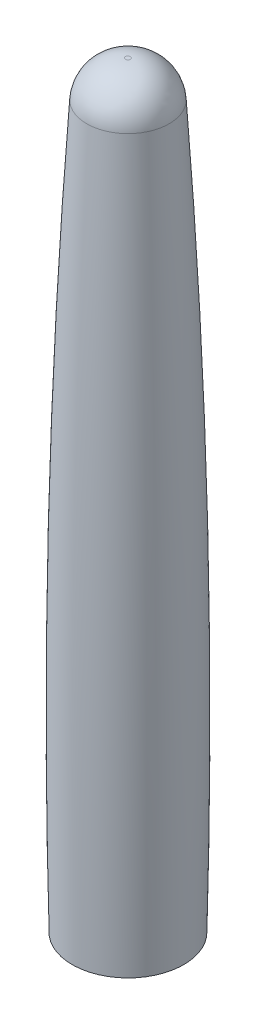
ISO-10303-21;
HEADER;
FILE_DESCRIPTION(('STEP AP214'),'2;1');
FILE_NAME('part.step','',(''),(''),'','','');
FILE_SCHEMA(('AUTOMOTIVE_DESIGN { 1 0 10303 214 1 1 1 1 }'));
ENDSEC;
DATA;
#1=APPLICATION_CONTEXT('core data for automotive mechanical design processes');
#2=APPLICATION_PROTOCOL_DEFINITION('international standard','automotive_design',2000,#1);
#3=PRODUCT_CONTEXT('',#1,'mechanical');
#4=PRODUCT('Part','Part','',(#3));
#5=PRODUCT_RELATED_PRODUCT_CATEGORY('part','',(#4));
#6=PRODUCT_DEFINITION_FORMATION('','',#4);
#7=PRODUCT_DEFINITION_CONTEXT('part definition',#1,'design');
#8=PRODUCT_DEFINITION('design','',#6,#7);
#9=PRODUCT_DEFINITION_SHAPE('','',#8);
#10=(LENGTH_UNIT() NAMED_UNIT(*) SI_UNIT(.MILLI.,.METRE.));
#11=(NAMED_UNIT(*) PLANE_ANGLE_UNIT() SI_UNIT($,.RADIAN.));
#12=(NAMED_UNIT(*) SI_UNIT($,.STERADIAN.) SOLID_ANGLE_UNIT());
#13=UNCERTAINTY_MEASURE_WITH_UNIT(LENGTH_MEASURE(1.E-05),#10,'distance_accuracy_value','');
#14=(GEOMETRIC_REPRESENTATION_CONTEXT(3) GLOBAL_UNCERTAINTY_ASSIGNED_CONTEXT((#13)) GLOBAL_UNIT_ASSIGNED_CONTEXT((#10,
#11,#12)) REPRESENTATION_CONTEXT('',''));
#15=CARTESIAN_POINT('',(0.,0.,0.));
#16=DIRECTION('',(0.,0.,1.));
#17=DIRECTION('',(1.,0.,0.));
#18=AXIS2_PLACEMENT_3D('',#15,#16,#17);
#19=CARTESIAN_POINT('',(-3.24502737243026,35.2084720497782,0.));
#20=CARTESIAN_POINT('',(-5.58275959622729,-1.86189907357107,0.));
#21=CARTESIAN_POINT('',(-4.74999999999999,-39.0000000018523,0.));
#22=B_SPLINE_CURVE_WITH_KNOTS('',2,(#19,#20,#21),.UNSPECIFIED.,.F.,.F.,(3,3),(0.,1.),.UNSPECIFIED.);
#23=CARTESIAN_POINT('',(0.,39.,0.));
#24=DIRECTION('',(0.,1.,0.));
#25=AXIS1_PLACEMENT('',#23,#24);
#26=SURFACE_OF_REVOLUTION('',#22,#25);
#27=CARTESIAN_POINT('',(0.,-39.0000000018523,0.));
#28=DIRECTION('',(0.,1.,0.));
#29=DIRECTION('',(-1.,0.,0.));
#30=AXIS2_PLACEMENT_3D('',#27,#28,#29);
#31=CIRCLE('',#30,4.74999999999999);
#32=CARTESIAN_POINT('',(-4.74999999999999,-39.0000000018523,0.));
#33=VERTEX_POINT('',#32);
#34=EDGE_CURVE('E57',#33,#33,#31,.T.);
#35=ORIENTED_EDGE('',*,*,#34,.F.);
#36=EDGE_LOOP('',(#35));
#37=FACE_BOUND('',#36,.T.);
#38=CARTESIAN_POINT('',(0.,35.208472049778,0.));
#39=DIRECTION('',(0.,1.,0.));
#40=DIRECTION('',(-1.,0.,0.));
#41=AXIS2_PLACEMENT_3D('',#38,#39,#40);
#42=CIRCLE('',#41,3.24502737243027);
#43=CARTESIAN_POINT('',(-3.24502737243028,35.208472049778,0.));
#44=VERTEX_POINT('',#43);
#45=EDGE_CURVE('E10',#44,#44,#42,.T.);
#46=ORIENTED_EDGE('',*,*,#45,.T.);
#47=EDGE_LOOP('',(#46));
#48=FACE_BOUND('',#47,.T.);
#49=ADVANCED_FACE('F34',(#37,#48),#26,.T.);
#50=CARTESIAN_POINT('',(0.,35.,0.));
#51=DIRECTION('',(0.,1.,0.));
#52=DIRECTION('',(-1.,0.,0.));
#53=AXIS2_PLACEMENT_3D('',#50,#51,#52);
#54=DEGENERATE_TOROIDAL_SURFACE('',#53,0.252279570750117,3.,.T.);
#55=ORIENTED_EDGE('',*,*,#45,.F.);
#56=EDGE_LOOP('',(#55));
#57=FACE_BOUND('',#56,.T.);
#58=CARTESIAN_POINT('',(0.,38.,0.));
#59=DIRECTION('',(0.,1.,0.));
#60=DIRECTION('',(-1.,0.,0.));
#61=AXIS2_PLACEMENT_3D('',#58,#59,#60);
#62=CIRCLE('',#61,0.252279570750117);
#63=CARTESIAN_POINT('',(-0.25227957075013,38.,0.));
#64=VERTEX_POINT('',#63);
#65=EDGE_CURVE('E41',#64,#64,#62,.T.);
#66=ORIENTED_EDGE('',*,*,#65,.T.);
#67=EDGE_LOOP('',(#66));
#68=FACE_BOUND('',#67,.T.);
#69=ADVANCED_FACE('F86',(#57,#68),#54,.F.);
#70=CARTESIAN_POINT('',(0.,38.,0.));
#71=DIRECTION('',(0.,1.,0.));
#72=DIRECTION('',(-1.,0.,0.));
#73=AXIS2_PLACEMENT_3D('',#70,#71,#72);
#74=PLANE('',#73);
#75=ORIENTED_EDGE('',*,*,#65,.F.);
#76=EDGE_LOOP('',(#75));
#77=FACE_BOUND('',#76,.T.);
#78=ADVANCED_FACE('F83',(#77),#74,.F.);
#79=CARTESIAN_POINT('',(0.,39.,0.));
#80=DIRECTION('',(0.,1.,0.));
#81=DIRECTION('',(-1.,0.,0.));
#82=AXIS2_PLACEMENT_3D('',#79,#80,#81);
#83=PLANE('',#82);
#84=CARTESIAN_POINT('',(0.,39.,0.));
#85=DIRECTION('',(0.,1.,0.));
#86=DIRECTION('',(-1.,0.,0.));
#87=AXIS2_PLACEMENT_3D('',#84,#85,#86);
#88=CIRCLE('',#87,0.252279570750117);
#89=CARTESIAN_POINT('',(-0.25227957075013,39.,0.));
#90=VERTEX_POINT('',#89);
#91=EDGE_CURVE('E45',#90,#90,#88,.T.);
#92=ORIENTED_EDGE('',*,*,#91,.T.);
#93=EDGE_LOOP('',(#92));
#94=FACE_BOUND('',#93,.T.);
#95=ADVANCED_FACE('F79',(#94),#83,.T.);
#96=CARTESIAN_POINT('',(0.,35.,0.));
#97=DIRECTION('',(0.,1.,0.));
#98=DIRECTION('',(-1.,0.,0.));
#99=AXIS2_PLACEMENT_3D('',#96,#97,#98);
#100=DEGENERATE_TOROIDAL_SURFACE('',#99,0.252279570750117,4.00000000000001,.T.);
#101=CARTESIAN_POINT('',(0.,35.2516116334161,0.));
#102=DIRECTION('',(0.,1.,0.));
#103=DIRECTION('',(-1.,0.,0.));
#104=AXIS2_PLACEMENT_3D('',#101,#102,#103);
#105=CIRCLE('',#104,4.24435817542836);
#106=CARTESIAN_POINT('',(-4.24435817542837,35.2516116334161,0.));
#107=VERTEX_POINT('',#106);
#108=EDGE_CURVE('E49',#107,#107,#105,.T.);
#109=ORIENTED_EDGE('',*,*,#108,.T.);
#110=EDGE_LOOP('',(#109));
#111=FACE_BOUND('',#110,.T.);
#112=ORIENTED_EDGE('',*,*,#91,.F.);
#113=EDGE_LOOP('',(#112));
#114=FACE_BOUND('',#113,.T.);
#115=ADVANCED_FACE('F75',(#111,#114),#100,.T.);
#116=CARTESIAN_POINT('',(-4.24435817542836,35.2516116334161,0.));
#117=CARTESIAN_POINT('',(-4.98461298013832,23.5067041036194,0.));
#118=CARTESIAN_POINT('',(-6.04124672917765,-1.23253276109622,0.));
#119=CARTESIAN_POINT('',(-6.04126154677835,-25.9944441671349,0.));
#120=CARTESIAN_POINT('',(-5.74999999999999,-39.0000000018523,0.));
#121=B_SPLINE_CURVE_WITH_KNOTS('',3,(#116,#117,#118,#119,#120),.UNSPECIFIED.,.F.,.F.,(4,1,4),
(0.0481023118156918,0.500240505189205,1.),.UNSPECIFIED.);
#122=CARTESIAN_POINT('',(0.,39.,0.));
#123=DIRECTION('',(0.,1.,0.));
#124=AXIS1_PLACEMENT('',#122,#123);
#125=SURFACE_OF_REVOLUTION('',#121,#124);
#126=CARTESIAN_POINT('',(0.,-39.0000000018523,0.));
#127=DIRECTION('',(0.,1.,0.));
#128=DIRECTION('',(-1.,0.,0.));
#129=AXIS2_PLACEMENT_3D('',#126,#127,#128);
#130=CIRCLE('',#129,5.74999999999999);
#131=CARTESIAN_POINT('',(-5.74999999999999,-39.0000000018523,0.));
#132=VERTEX_POINT('',#131);
#133=EDGE_CURVE('E54',#132,#132,#130,.T.);
#134=ORIENTED_EDGE('',*,*,#133,.T.);
#135=EDGE_LOOP('',(#134));
#136=FACE_BOUND('',#135,.T.);
#137=ORIENTED_EDGE('',*,*,#108,.F.);
#138=EDGE_LOOP('',(#137));
#139=FACE_BOUND('',#138,.T.);
#140=ADVANCED_FACE('F70',(#136,#139),#125,.F.);
#141=CARTESIAN_POINT('',(0.,-39.0000000018523,0.));
#142=DIRECTION('',(0.,-1.,0.));
#143=DIRECTION('',(1.,0.,0.));
#144=AXIS2_PLACEMENT_3D('',#141,#142,#143);
#145=PLANE('',#144);
#146=ORIENTED_EDGE('',*,*,#34,.T.);
#147=EDGE_LOOP('',(#146));
#148=FACE_BOUND('',#147,.T.);
#149=ORIENTED_EDGE('',*,*,#133,.F.);
#150=EDGE_LOOP('',(#149));
#151=FACE_BOUND('',#150,.T.);
#152=ADVANCED_FACE('F74',(#148,#151),#145,.T.);
#153=CLOSED_SHELL('',(#49,#69,#78,#95,#115,#140,#152));
#154=MANIFOLD_SOLID_BREP('B2',#153);
#155=ADVANCED_BREP_SHAPE_REPRESENTATION('',(#18,#154),#14);
#156=SHAPE_DEFINITION_REPRESENTATION(#9,#155);
ENDSEC;
END-ISO-10303-21;
